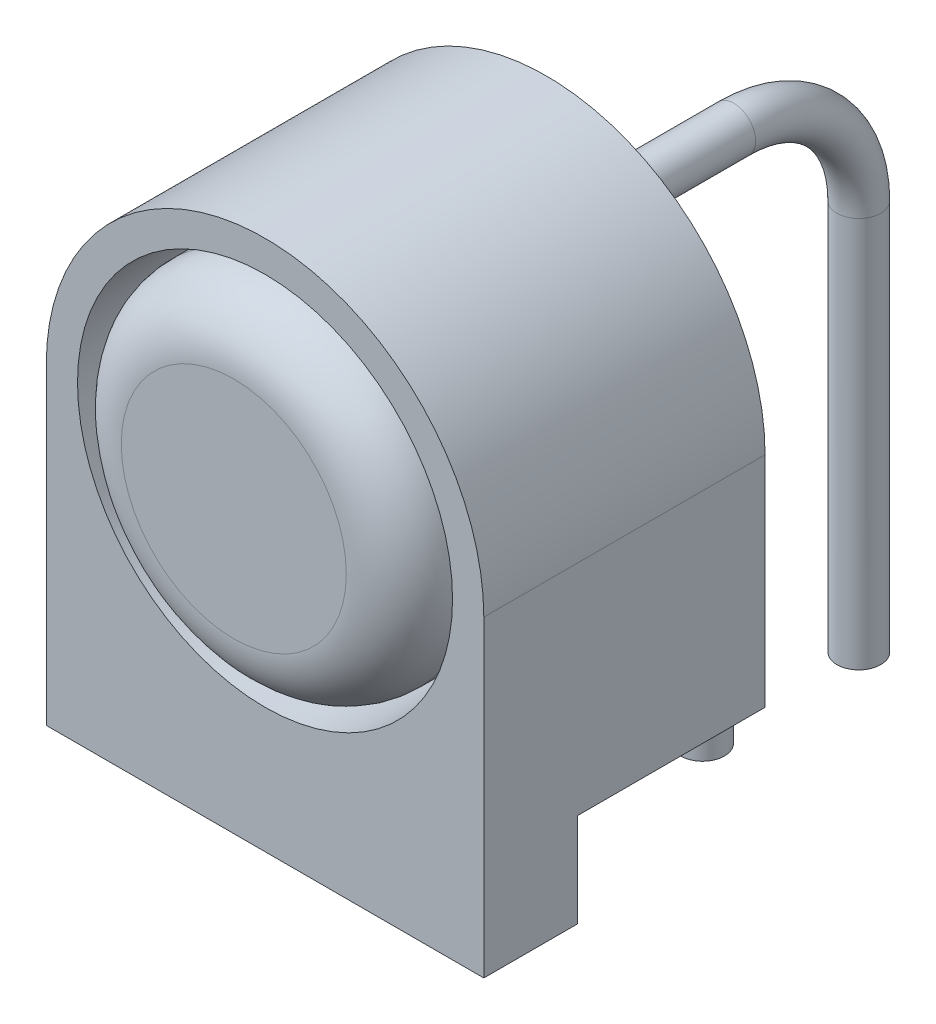
ISO-10303-21;
HEADER;
FILE_DESCRIPTION(('STEP AP214'),'2;1');
FILE_NAME('part.step','',(''),(''),'','','');
FILE_SCHEMA(('AUTOMOTIVE_DESIGN { 1 0 10303 214 1 1 1 1 }'));
ENDSEC;
DATA;
#1=APPLICATION_CONTEXT('core data for automotive mechanical design processes');
#2=APPLICATION_PROTOCOL_DEFINITION('international standard','automotive_design',2000,#1);
#3=PRODUCT_CONTEXT('',#1,'mechanical');
#4=PRODUCT('Part','Part','',(#3));
#5=PRODUCT_RELATED_PRODUCT_CATEGORY('part','',(#4));
#6=PRODUCT_DEFINITION_FORMATION('','',#4);
#7=PRODUCT_DEFINITION_CONTEXT('part definition',#1,'design');
#8=PRODUCT_DEFINITION('design','',#6,#7);
#9=PRODUCT_DEFINITION_SHAPE('','',#8);
#10=(LENGTH_UNIT() NAMED_UNIT(*) SI_UNIT(.MILLI.,.METRE.));
#11=(NAMED_UNIT(*) PLANE_ANGLE_UNIT() SI_UNIT($,.RADIAN.));
#12=(NAMED_UNIT(*) SI_UNIT($,.STERADIAN.) SOLID_ANGLE_UNIT());
#13=UNCERTAINTY_MEASURE_WITH_UNIT(LENGTH_MEASURE(1.E-05),#10,'distance_accuracy_value','');
#14=(GEOMETRIC_REPRESENTATION_CONTEXT(3) GLOBAL_UNCERTAINTY_ASSIGNED_CONTEXT((#13)) GLOBAL_UNIT_ASSIGNED_CONTEXT((#10,
#11,#12)) REPRESENTATION_CONTEXT('',''));
#15=CARTESIAN_POINT('',(0.,0.,0.));
#16=DIRECTION('',(0.,0.,1.));
#17=DIRECTION('',(1.,0.,0.));
#18=AXIS2_PLACEMENT_3D('',#15,#16,#17);
#19=CARTESIAN_POINT('',(0.,0.,0.));
#20=DIRECTION('',(0.,0.,1.));
#21=DIRECTION('',(1.,0.,0.));
#22=AXIS2_PLACEMENT_3D('',#19,#20,#21);
#23=PLANE('',#22);
#24=CARTESIAN_POINT('',(0.,1.27,0.));
#25=DIRECTION('',(0.,0.,1.));
#26=DIRECTION('',(1.,0.,0.));
#27=AXIS2_PLACEMENT_3D('',#24,#25,#26);
#28=CIRCLE('',#27,0.35);
#29=CARTESIAN_POINT('',(0.35,1.27,0.));
#30=VERTEX_POINT('',#29);
#31=EDGE_CURVE('E200',#30,#30,#28,.F.);
#32=ORIENTED_EDGE('',*,*,#31,.F.);
#33=EDGE_LOOP('',(#32));
#34=FACE_BOUND('',#33,.T.);
#35=CARTESIAN_POINT('',(0.,-1.27,0.));
#36=DIRECTION('',(0.,0.,1.));
#37=DIRECTION('',(1.,0.,0.));
#38=AXIS2_PLACEMENT_3D('',#35,#36,#37);
#39=CIRCLE('',#38,0.35);
#40=CARTESIAN_POINT('',(0.35,-1.27,0.));
#41=VERTEX_POINT('',#40);
#42=EDGE_CURVE('E197',#41,#41,#39,.F.);
#43=ORIENTED_EDGE('',*,*,#42,.F.);
#44=EDGE_LOOP('',(#43));
#45=FACE_BOUND('',#44,.T.);
#46=DIRECTION('',(1.,0.,0.));
#47=VECTOR('',#46,1.);
#48=CARTESIAN_POINT('',(-3.5,-3.5,0.));
#49=LINE('',#48,#47);
#50=CARTESIAN_POINT('',(-3.5,-3.5,0.));
#51=VERTEX_POINT('',#50);
#52=CARTESIAN_POINT('',(3.5,-3.5,0.));
#53=VERTEX_POINT('',#52);
#54=EDGE_CURVE('E156',#51,#53,#49,.T.);
#55=ORIENTED_EDGE('',*,*,#54,.F.);
#56=DIRECTION('',(0.,-1.,0.));
#57=VECTOR('',#56,1.);
#58=CARTESIAN_POINT('',(-3.5,-3.5,0.));
#59=LINE('',#58,#57);
#60=CARTESIAN_POINT('',(-3.5,0.,0.));
#61=VERTEX_POINT('',#60);
#62=EDGE_CURVE('E178',#61,#51,#59,.T.);
#63=ORIENTED_EDGE('',*,*,#62,.F.);
#64=CARTESIAN_POINT('',(0.,0.,0.));
#65=DIRECTION('',(0.,0.,1.));
#66=DIRECTION('',(1.,0.,0.));
#67=AXIS2_PLACEMENT_3D('',#64,#65,#66);
#68=CIRCLE('',#67,3.5);
#69=CARTESIAN_POINT('',(3.5,0.,0.));
#70=VERTEX_POINT('',#69);
#71=EDGE_CURVE('E102',#70,#61,#68,.T.);
#72=ORIENTED_EDGE('',*,*,#71,.F.);
#73=DIRECTION('',(0.,1.,0.));
#74=VECTOR('',#73,1.);
#75=CARTESIAN_POINT('',(3.5,-3.5,0.));
#76=LINE('',#75,#74);
#77=EDGE_CURVE('E174',#53,#70,#76,.T.);
#78=ORIENTED_EDGE('',*,*,#77,.F.);
#79=EDGE_LOOP('',(#55,#63,#72,#78));
#80=FACE_BOUND('',#79,.T.);
#81=ADVANCED_FACE('F61',(#34,#45,#80),#23,.F.);
#82=CARTESIAN_POINT('',(-3.5,-5.,4.5));
#83=DIRECTION('',(0.,1.,0.));
#84=DIRECTION('',(-1.,0.,0.));
#85=AXIS2_PLACEMENT_3D('',#82,#83,#84);
#86=PLANE('',#85);
#87=DIRECTION('',(0.,0.,-1.));
#88=VECTOR('',#87,1.);
#89=CARTESIAN_POINT('',(-3.5,-5.,4.5));
#90=LINE('',#89,#88);
#91=CARTESIAN_POINT('',(-3.5,-5.,4.5));
#92=VERTEX_POINT('',#91);
#93=CARTESIAN_POINT('',(-3.5,-5.,3.));
#94=VERTEX_POINT('',#93);
#95=EDGE_CURVE('E195',#92,#94,#90,.T.);
#96=ORIENTED_EDGE('',*,*,#95,.T.);
#97=DIRECTION('',(-1.,0.,0.));
#98=VECTOR('',#97,1.);
#99=CARTESIAN_POINT('',(0.146156233035948,-5.,3.));
#100=LINE('',#99,#98);
#101=CARTESIAN_POINT('',(3.5,-5.,3.));
#102=VERTEX_POINT('',#101);
#103=EDGE_CURVE('E152',#102,#94,#100,.T.);
#104=ORIENTED_EDGE('',*,*,#103,.F.);
#105=DIRECTION('',(0.,0.,-1.));
#106=VECTOR('',#105,1.);
#107=CARTESIAN_POINT('',(3.5,-5.,4.5));
#108=LINE('',#107,#106);
#109=CARTESIAN_POINT('',(3.5,-5.,4.5));
#110=VERTEX_POINT('',#109);
#111=EDGE_CURVE('E192',#110,#102,#108,.T.);
#112=ORIENTED_EDGE('',*,*,#111,.F.);
#113=DIRECTION('',(1.,0.,0.));
#114=VECTOR('',#113,1.);
#115=CARTESIAN_POINT('',(-3.5,-5.,4.5));
#116=LINE('',#115,#114);
#117=EDGE_CURVE('E109',#92,#110,#116,.T.);
#118=ORIENTED_EDGE('',*,*,#117,.F.);
#119=EDGE_LOOP('',(#96,#104,#112,#118));
#120=FACE_BOUND('',#119,.T.);
#121=ADVANCED_FACE('F222',(#120),#86,.F.);
#122=CARTESIAN_POINT('',(3.5,-3.5,4.5));
#123=DIRECTION('',(-1.,0.,0.));
#124=DIRECTION('',(0.,0.,1.));
#125=AXIS2_PLACEMENT_3D('',#122,#123,#124);
#126=PLANE('',#125);
#127=ORIENTED_EDGE('',*,*,#111,.T.);
#128=DIRECTION('',(0.,-1.,0.));
#129=VECTOR('',#128,1.);
#130=CARTESIAN_POINT('',(3.5,-3.5,3.));
#131=LINE('',#130,#129);
#132=CARTESIAN_POINT('',(3.5,-3.5,3.));
#133=VERTEX_POINT('',#132);
#134=EDGE_CURVE('E163',#133,#102,#131,.T.);
#135=ORIENTED_EDGE('',*,*,#134,.F.);
#136=DIRECTION('',(0.,0.,1.));
#137=VECTOR('',#136,1.);
#138=CARTESIAN_POINT('',(3.5,-3.5,0.));
#139=LINE('',#138,#137);
#140=EDGE_CURVE('E158',#53,#133,#139,.T.);
#141=ORIENTED_EDGE('',*,*,#140,.F.);
#142=ORIENTED_EDGE('',*,*,#77,.T.);
#143=DIRECTION('',(0.,0.,-1.));
#144=VECTOR('',#143,1.);
#145=CARTESIAN_POINT('',(3.5,0.,4.5));
#146=LINE('',#145,#144);
#147=CARTESIAN_POINT('',(3.5,0.,4.5));
#148=VERTEX_POINT('',#147);
#149=EDGE_CURVE('E190',#148,#70,#146,.T.);
#150=ORIENTED_EDGE('',*,*,#149,.F.);
#151=DIRECTION('',(0.,1.,0.));
#152=VECTOR('',#151,1.);
#153=CARTESIAN_POINT('',(3.5,-3.5,4.5));
#154=LINE('',#153,#152);
#155=EDGE_CURVE('E180',#110,#148,#154,.T.);
#156=ORIENTED_EDGE('',*,*,#155,.F.);
#157=EDGE_LOOP('',(#127,#135,#141,#142,#150,#156));
#158=FACE_BOUND('',#157,.T.);
#159=ADVANCED_FACE('F228',(#158),#126,.F.);
#160=CARTESIAN_POINT('',(0.,0.,4.5));
#161=DIRECTION('',(0.,0.,-1.));
#162=DIRECTION('',(-1.,0.,0.));
#163=AXIS2_PLACEMENT_3D('',#160,#161,#162);
#164=CYLINDRICAL_SURFACE('',#163,3.5);
#165=ORIENTED_EDGE('',*,*,#71,.T.);
#166=DIRECTION('',(0.,0.,-1.));
#167=VECTOR('',#166,1.);
#168=CARTESIAN_POINT('',(-3.5,0.,4.5));
#169=LINE('',#168,#167);
#170=CARTESIAN_POINT('',(-3.5,0.,4.5));
#171=VERTEX_POINT('',#170);
#172=EDGE_CURVE('E184',#171,#61,#169,.T.);
#173=ORIENTED_EDGE('',*,*,#172,.F.);
#174=CARTESIAN_POINT('',(0.,0.,4.5));
#175=DIRECTION('',(0.,0.,1.));
#176=DIRECTION('',(1.,0.,0.));
#177=AXIS2_PLACEMENT_3D('',#174,#175,#176);
#178=CIRCLE('',#177,3.5);
#179=EDGE_CURVE('E182',#148,#171,#178,.T.);
#180=ORIENTED_EDGE('',*,*,#179,.F.);
#181=ORIENTED_EDGE('',*,*,#149,.T.);
#182=EDGE_LOOP('',(#165,#173,#180,#181));
#183=FACE_BOUND('',#182,.T.);
#184=ADVANCED_FACE('F238',(#183),#164,.T.);
#185=CARTESIAN_POINT('',(-3.5,-3.5,4.5));
#186=DIRECTION('',(1.,0.,0.));
#187=DIRECTION('',(0.,0.,-1.));
#188=AXIS2_PLACEMENT_3D('',#185,#186,#187);
#189=PLANE('',#188);
#190=DIRECTION('',(0.,0.,-1.));
#191=VECTOR('',#190,1.);
#192=CARTESIAN_POINT('',(-3.5,-3.5,3.));
#193=LINE('',#192,#191);
#194=CARTESIAN_POINT('',(-3.5,-3.5,3.));
#195=VERTEX_POINT('',#194);
#196=EDGE_CURVE('E76',#195,#51,#193,.T.);
#197=ORIENTED_EDGE('',*,*,#196,.F.);
#198=DIRECTION('',(0.,-1.,0.));
#199=VECTOR('',#198,1.);
#200=CARTESIAN_POINT('',(-3.5,-3.5,3.));
#201=LINE('',#200,#199);
#202=EDGE_CURVE('E161',#195,#94,#201,.T.);
#203=ORIENTED_EDGE('',*,*,#202,.T.);
#204=ORIENTED_EDGE('',*,*,#95,.F.);
#205=DIRECTION('',(0.,-1.,0.));
#206=VECTOR('',#205,1.);
#207=CARTESIAN_POINT('',(-3.5,-3.5,4.5));
#208=LINE('',#207,#206);
#209=EDGE_CURVE('E85',#171,#92,#208,.T.);
#210=ORIENTED_EDGE('',*,*,#209,.F.);
#211=ORIENTED_EDGE('',*,*,#172,.T.);
#212=ORIENTED_EDGE('',*,*,#62,.T.);
#213=EDGE_LOOP('',(#197,#203,#204,#210,#211,#212));
#214=FACE_BOUND('',#213,.T.);
#215=ADVANCED_FACE('F235',(#214),#189,.F.);
#216=CARTESIAN_POINT('',(0.,0.,4.5));
#217=DIRECTION('',(0.,0.,1.));
#218=DIRECTION('',(1.,0.,0.));
#219=AXIS2_PLACEMENT_3D('',#216,#217,#218);
#220=PLANE('',#219);
#221=CARTESIAN_POINT('',(0.,0.,4.5));
#222=DIRECTION('',(0.,0.,1.));
#223=DIRECTION('',(1.,0.,0.));
#224=AXIS2_PLACEMENT_3D('',#221,#222,#223);
#225=CIRCLE('',#224,3.);
#226=CARTESIAN_POINT('',(3.,0.,4.5));
#227=VERTEX_POINT('',#226);
#228=EDGE_CURVE('E170',#227,#227,#225,.T.);
#229=ORIENTED_EDGE('',*,*,#228,.F.);
#230=EDGE_LOOP('',(#229));
#231=FACE_BOUND('',#230,.T.);
#232=ORIENTED_EDGE('',*,*,#209,.T.);
#233=ORIENTED_EDGE('',*,*,#117,.T.);
#234=ORIENTED_EDGE('',*,*,#155,.T.);
#235=ORIENTED_EDGE('',*,*,#179,.T.);
#236=EDGE_LOOP('',(#232,#233,#234,#235));
#237=FACE_BOUND('',#236,.T.);
#238=ADVANCED_FACE('F233',(#231,#237),#220,.T.);
#239=CARTESIAN_POINT('',(0.,0.,1.));
#240=DIRECTION('',(0.,0.,1.));
#241=DIRECTION('',(1.,0.,0.));
#242=AXIS2_PLACEMENT_3D('',#239,#240,#241);
#243=CYLINDRICAL_SURFACE('',#242,3.);
#244=CARTESIAN_POINT('',(0.,0.,1.));
#245=DIRECTION('',(0.,0.,1.));
#246=DIRECTION('',(1.,0.,0.));
#247=AXIS2_PLACEMENT_3D('',#244,#245,#246);
#248=CIRCLE('',#247,3.);
#249=CARTESIAN_POINT('',(3.,0.,1.));
#250=VERTEX_POINT('',#249);
#251=EDGE_CURVE('E171',#250,#250,#248,.T.);
#252=ORIENTED_EDGE('',*,*,#251,.F.);
#253=EDGE_LOOP('',(#252));
#254=FACE_BOUND('',#253,.T.);
#255=ORIENTED_EDGE('',*,*,#228,.T.);
#256=EDGE_LOOP('',(#255));
#257=FACE_BOUND('',#256,.T.);
#258=ADVANCED_FACE('F260',(#254,#257),#243,.F.);
#259=CARTESIAN_POINT('',(0.,0.,1.));
#260=DIRECTION('',(0.,0.,1.));
#261=DIRECTION('',(1.,0.,0.));
#262=AXIS2_PLACEMENT_3D('',#259,#260,#261);
#263=PLANE('',#262);
#264=CARTESIAN_POINT('',(0.,0.,1.));
#265=DIRECTION('',(0.,0.,1.));
#266=DIRECTION('',(1.,0.,0.));
#267=AXIS2_PLACEMENT_3D('',#264,#265,#266);
#268=CIRCLE('',#267,2.8);
#269=CARTESIAN_POINT('',(2.8,0.,1.));
#270=VERTEX_POINT('',#269);
#271=EDGE_CURVE('E165',#270,#270,#268,.T.);
#272=ORIENTED_EDGE('',*,*,#271,.F.);
#273=EDGE_LOOP('',(#272));
#274=FACE_BOUND('',#273,.T.);
#275=ORIENTED_EDGE('',*,*,#251,.T.);
#276=EDGE_LOOP('',(#275));
#277=FACE_BOUND('',#276,.T.);
#278=ADVANCED_FACE('F265',(#274,#277),#263,.T.);
#279=CARTESIAN_POINT('',(0.,0.,5.));
#280=DIRECTION('',(0.,0.,-1.));
#281=DIRECTION('',(-1.,0.,0.));
#282=AXIS2_PLACEMENT_3D('',#279,#280,#281);
#283=CYLINDRICAL_SURFACE('',#282,2.8);
#284=CARTESIAN_POINT('',(0.,0.,4.));
#285=DIRECTION('',(0.,0.,1.));
#286=DIRECTION('',(1.,0.,0.));
#287=AXIS2_PLACEMENT_3D('',#284,#285,#286);
#288=CIRCLE('',#287,2.8);
#289=CARTESIAN_POINT('',(2.8,0.,4.));
#290=VERTEX_POINT('',#289);
#291=EDGE_CURVE('E12',#290,#290,#288,.F.);
#292=ORIENTED_EDGE('',*,*,#291,.T.);
#293=EDGE_LOOP('',(#292));
#294=FACE_BOUND('',#293,.T.);
#295=ORIENTED_EDGE('',*,*,#271,.T.);
#296=EDGE_LOOP('',(#295));
#297=FACE_BOUND('',#296,.T.);
#298=ADVANCED_FACE('F272',(#294,#297),#283,.T.);
#299=CARTESIAN_POINT('',(0.,0.,5.));
#300=DIRECTION('',(0.,0.,1.));
#301=DIRECTION('',(1.,0.,0.));
#302=AXIS2_PLACEMENT_3D('',#299,#300,#301);
#303=PLANE('',#302);
#304=CARTESIAN_POINT('',(0.,0.,5.));
#305=DIRECTION('',(0.,0.,1.));
#306=DIRECTION('',(1.,0.,0.));
#307=AXIS2_PLACEMENT_3D('',#304,#305,#306);
#308=CIRCLE('',#307,1.8);
#309=CARTESIAN_POINT('',(1.8,0.,5.));
#310=VERTEX_POINT('',#309);
#311=EDGE_CURVE('E69',#310,#310,#308,.T.);
#312=ORIENTED_EDGE('',*,*,#311,.T.);
#313=EDGE_LOOP('',(#312));
#314=FACE_BOUND('',#313,.T.);
#315=ADVANCED_FACE('F205',(#314),#303,.T.);
#316=CARTESIAN_POINT('',(0.146156233035948,-3.5,3.));
#317=DIRECTION('',(0.,0.,1.));
#318=DIRECTION('',(1.,0.,0.));
#319=AXIS2_PLACEMENT_3D('',#316,#317,#318);
#320=PLANE('',#319);
#321=ORIENTED_EDGE('',*,*,#103,.T.);
#322=ORIENTED_EDGE('',*,*,#202,.F.);
#323=DIRECTION('',(-1.,0.,0.));
#324=VECTOR('',#323,1.);
#325=CARTESIAN_POINT('',(3.5,-3.5,3.));
#326=LINE('',#325,#324);
#327=EDGE_CURVE('E153',#133,#195,#326,.T.);
#328=ORIENTED_EDGE('',*,*,#327,.F.);
#329=ORIENTED_EDGE('',*,*,#134,.T.);
#330=EDGE_LOOP('',(#321,#322,#328,#329));
#331=FACE_BOUND('',#330,.T.);
#332=ADVANCED_FACE('F252',(#331),#320,.F.);
#333=CARTESIAN_POINT('',(0.,-3.5,0.));
#334=DIRECTION('',(0.,-1.,0.));
#335=DIRECTION('',(0.,0.,-1.));
#336=AXIS2_PLACEMENT_3D('',#333,#334,#335);
#337=PLANE('',#336);
#338=ORIENTED_EDGE('',*,*,#327,.T.);
#339=ORIENTED_EDGE('',*,*,#196,.T.);
#340=ORIENTED_EDGE('',*,*,#54,.T.);
#341=ORIENTED_EDGE('',*,*,#140,.T.);
#342=EDGE_LOOP('',(#338,#339,#340,#341));
#343=FACE_BOUND('',#342,.T.);
#344=ADVANCED_FACE('F256',(#343),#337,.T.);
#345=CARTESIAN_POINT('',(0.,-7.,-2.5));
#346=DIRECTION('',(0.,1.,0.));
#347=DIRECTION('',(0.,0.,1.));
#348=AXIS2_PLACEMENT_3D('',#345,#346,#347);
#349=PLANE('',#348);
#350=CARTESIAN_POINT('',(0.,-7.,-2.5));
#351=DIRECTION('',(0.,1.,0.));
#352=DIRECTION('',(0.,0.,1.));
#353=AXIS2_PLACEMENT_3D('',#350,#351,#352);
#354=CIRCLE('',#353,0.35);
#355=CARTESIAN_POINT('',(0.,-7.,-2.15));
#356=VERTEX_POINT('',#355);
#357=EDGE_CURVE('E150',#356,#356,#354,.T.);
#358=ORIENTED_EDGE('',*,*,#357,.F.);
#359=EDGE_LOOP('',(#358));
#360=FACE_BOUND('',#359,.T.);
#361=ADVANCED_FACE('F215',(#360),#349,.F.);
#362=CARTESIAN_POINT('',(0.,-1.27,0.));
#363=DIRECTION('',(0.,0.,-1.));
#364=DIRECTION('',(-1.,0.,0.));
#365=AXIS2_PLACEMENT_3D('',#362,#363,#364);
#366=CYLINDRICAL_SURFACE('',#365,0.35);
#367=CARTESIAN_POINT('',(0.,-1.27,-1.49999999999999));
#368=DIRECTION('',(0.,0.,1.));
#369=DIRECTION('',(0.,-1.,0.));
#370=AXIS2_PLACEMENT_3D('',#367,#368,#369);
#371=CIRCLE('',#370,0.35);
#372=CARTESIAN_POINT('',(0.,-0.92,-1.49999999999999));
#373=VERTEX_POINT('',#372);
#374=EDGE_CURVE('E134',#373,#373,#371,.T.);
#375=ORIENTED_EDGE('',*,*,#374,.T.);
#376=EDGE_LOOP('',(#375));
#377=FACE_BOUND('',#376,.T.);
#378=ORIENTED_EDGE('',*,*,#42,.T.);
#379=EDGE_LOOP('',(#378));
#380=FACE_BOUND('',#379,.T.);
#381=ADVANCED_FACE('F288',(#377,#380),#366,.T.);
#382=CARTESIAN_POINT('',(0.,-2.27,-1.5));
#383=DIRECTION('',(-1.,0.,0.));
#384=DIRECTION('',(0.,0.,1.));
#385=AXIS2_PLACEMENT_3D('',#382,#383,#384);
#386=TOROIDAL_SURFACE('',#385,1.,0.35);
#387=CARTESIAN_POINT('',(0.,-2.26999999999999,-2.50000000000004));
#388=DIRECTION('',(0.,1.,0.));
#389=DIRECTION('',(0.,0.,1.));
#390=AXIS2_PLACEMENT_3D('',#387,#388,#389);
#391=CIRCLE('',#390,0.35);
#392=CARTESIAN_POINT('',(0.,-2.26999999999999,-2.85));
#393=VERTEX_POINT('',#392);
#394=EDGE_CURVE('E138',#393,#393,#391,.T.);
#395=CARTESIAN_POINT('',(0.,-2.27,-1.5));
#396=DIRECTION('',(-1.,0.,0.));
#397=DIRECTION('',(0.,0.,1.));
#398=AXIS2_PLACEMENT_3D('',#395,#396,#397);
#399=CIRCLE('',#398,1.35);
#400=EDGE_CURVE('',#373,#393,#399,.T.);
#401=ORIENTED_EDGE('',*,*,#374,.F.);
#402=ORIENTED_EDGE('',*,*,#394,.T.);
#403=ORIENTED_EDGE('',*,*,#400,.T.);
#404=ORIENTED_EDGE('',*,*,#400,.F.);
#405=EDGE_LOOP('',(#401,#403,#402,#404));
#406=FACE_BOUND('',#405,.T.);
#407=ADVANCED_FACE('F296',(#406),#386,.T.);
#408=CARTESIAN_POINT('',(0.,-2.27000000000001,-2.5));
#409=DIRECTION('',(0.,-1.,0.));
#410=DIRECTION('',(0.,0.,-1.));
#411=AXIS2_PLACEMENT_3D('',#408,#409,#410);
#412=CYLINDRICAL_SURFACE('',#411,0.35);
#413=CARTESIAN_POINT('',(0.,-5.,-2.5));
#414=DIRECTION('',(0.,1.,0.));
#415=DIRECTION('',(0.,0.,1.));
#416=AXIS2_PLACEMENT_3D('',#413,#414,#415);
#417=CIRCLE('',#416,0.35);
#418=CARTESIAN_POINT('',(0.,-5.,-2.15));
#419=VERTEX_POINT('',#418);
#420=EDGE_CURVE('E147',#419,#419,#417,.T.);
#421=ORIENTED_EDGE('',*,*,#420,.T.);
#422=EDGE_LOOP('',(#421));
#423=FACE_BOUND('',#422,.T.);
#424=ORIENTED_EDGE('',*,*,#394,.F.);
#425=EDGE_LOOP('',(#424));
#426=FACE_BOUND('',#425,.T.);
#427=ADVANCED_FACE('F292',(#423,#426),#412,.T.);
#428=CARTESIAN_POINT('',(0.,-5.,-2.5));
#429=DIRECTION('',(0.,-1.,0.));
#430=DIRECTION('',(0.,0.,-1.));
#431=AXIS2_PLACEMENT_3D('',#428,#429,#430);
#432=CYLINDRICAL_SURFACE('',#431,0.35);
#433=ORIENTED_EDGE('',*,*,#357,.T.);
#434=EDGE_LOOP('',(#433));
#435=FACE_BOUND('',#434,.T.);
#436=ORIENTED_EDGE('',*,*,#420,.F.);
#437=EDGE_LOOP('',(#436));
#438=FACE_BOUND('',#437,.T.);
#439=ADVANCED_FACE('F219',(#435,#438),#432,.T.);
#440=CARTESIAN_POINT('',(0.,-6.98466646622907,-5.));
#441=DIRECTION('',(0.,1.,0.));
#442=DIRECTION('',(0.,0.,1.));
#443=AXIS2_PLACEMENT_3D('',#440,#441,#442);
#444=PLANE('',#443);
#445=CARTESIAN_POINT('',(0.,-6.98466646622907,-5.));
#446=DIRECTION('',(0.,1.,0.));
#447=DIRECTION('',(0.,0.,1.));
#448=AXIS2_PLACEMENT_3D('',#445,#446,#447);
#449=CIRCLE('',#448,0.35);
#450=CARTESIAN_POINT('',(0.,-6.98466646622907,-4.65));
#451=VERTEX_POINT('',#450);
#452=EDGE_CURVE('E130',#451,#451,#449,.T.);
#453=ORIENTED_EDGE('',*,*,#452,.F.);
#454=EDGE_LOOP('',(#453));
#455=FACE_BOUND('',#454,.T.);
#456=ADVANCED_FACE('F209',(#455),#444,.F.);
#457=CARTESIAN_POINT('',(0.,1.27,0.));
#458=DIRECTION('',(0.,0.,-1.));
#459=DIRECTION('',(0.,1.,0.));
#460=AXIS2_PLACEMENT_3D('',#457,#458,#459);
#461=CYLINDRICAL_SURFACE('',#460,0.35);
#462=CARTESIAN_POINT('',(0.,1.27,-2.99999999999999));
#463=DIRECTION('',(0.,0.,1.));
#464=DIRECTION('',(0.,-1.,0.));
#465=AXIS2_PLACEMENT_3D('',#462,#463,#464);
#466=CIRCLE('',#465,0.35);
#467=CARTESIAN_POINT('',(0.,1.62,-2.99999999999998));
#468=VERTEX_POINT('',#467);
#469=EDGE_CURVE('E141',#468,#468,#466,.T.);
#470=ORIENTED_EDGE('',*,*,#469,.T.);
#471=EDGE_LOOP('',(#470));
#472=FACE_BOUND('',#471,.T.);
#473=ORIENTED_EDGE('',*,*,#31,.T.);
#474=EDGE_LOOP('',(#473));
#475=FACE_BOUND('',#474,.T.);
#476=ADVANCED_FACE('F218',(#472,#475),#461,.T.);
#477=CARTESIAN_POINT('',(0.,-0.730000000000001,-3.));
#478=DIRECTION('',(-1.,0.,0.));
#479=DIRECTION('',(0.,0.,1.));
#480=AXIS2_PLACEMENT_3D('',#477,#478,#479);
#481=TOROIDAL_SURFACE('',#480,2.,0.35);
#482=CARTESIAN_POINT('',(0.,-0.730000000000001,-5.));
#483=DIRECTION('',(0.,1.,0.));
#484=DIRECTION('',(0.,0.,1.));
#485=AXIS2_PLACEMENT_3D('',#482,#483,#484);
#486=CIRCLE('',#485,0.35);
#487=CARTESIAN_POINT('',(0.,-0.730000000000001,-5.35));
#488=VERTEX_POINT('',#487);
#489=EDGE_CURVE('E135',#488,#488,#486,.T.);
#490=CARTESIAN_POINT('',(0.,-0.730000000000001,-3.));
#491=DIRECTION('',(-1.,0.,0.));
#492=DIRECTION('',(0.,0.,1.));
#493=AXIS2_PLACEMENT_3D('',#490,#491,#492);
#494=CIRCLE('',#493,2.35);
#495=EDGE_CURVE('',#468,#488,#494,.T.);
#496=ORIENTED_EDGE('',*,*,#469,.F.);
#497=ORIENTED_EDGE('',*,*,#489,.T.);
#498=ORIENTED_EDGE('',*,*,#495,.T.);
#499=ORIENTED_EDGE('',*,*,#495,.F.);
#500=EDGE_LOOP('',(#496,#498,#497,#499));
#501=FACE_BOUND('',#500,.T.);
#502=ADVANCED_FACE('F213',(#501),#481,.T.);
#503=CARTESIAN_POINT('',(0.,-0.730000000000015,-5.));
#504=DIRECTION('',(0.,-1.,0.));
#505=DIRECTION('',(0.,0.,-1.));
#506=AXIS2_PLACEMENT_3D('',#503,#504,#505);
#507=CYLINDRICAL_SURFACE('',#506,0.35);
#508=ORIENTED_EDGE('',*,*,#452,.T.);
#509=EDGE_LOOP('',(#508));
#510=FACE_BOUND('',#509,.T.);
#511=ORIENTED_EDGE('',*,*,#489,.F.);
#512=EDGE_LOOP('',(#511));
#513=FACE_BOUND('',#512,.T.);
#514=ADVANCED_FACE('F131',(#510,#513),#507,.T.);
#515=CARTESIAN_POINT('',(0.,0.,4.));
#516=DIRECTION('',(0.,0.,1.));
#517=DIRECTION('',(1.,0.,0.));
#518=AXIS2_PLACEMENT_3D('',#515,#516,#517);
#519=TOROIDAL_SURFACE('',#518,1.8,1.);
#520=ORIENTED_EDGE('',*,*,#291,.F.);
#521=EDGE_LOOP('',(#520));
#522=FACE_BOUND('',#521,.T.);
#523=ORIENTED_EDGE('',*,*,#311,.F.);
#524=EDGE_LOOP('',(#523));
#525=FACE_BOUND('',#524,.T.);
#526=ADVANCED_FACE('F63',(#522,#525),#519,.T.);
#527=CLOSED_SHELL('',(#81,#121,#159,#184,#215,#238,#258,#278,#298,#315,#332,#344,#361,#381,#407,
#427,#439,#456,#476,#502,#514,#526));
#528=MANIFOLD_SOLID_BREP('B2',#527);
#529=ADVANCED_BREP_SHAPE_REPRESENTATION('',(#18,#528),#14);
#530=SHAPE_DEFINITION_REPRESENTATION(#9,#529);
ENDSEC;
END-ISO-10303-21;
